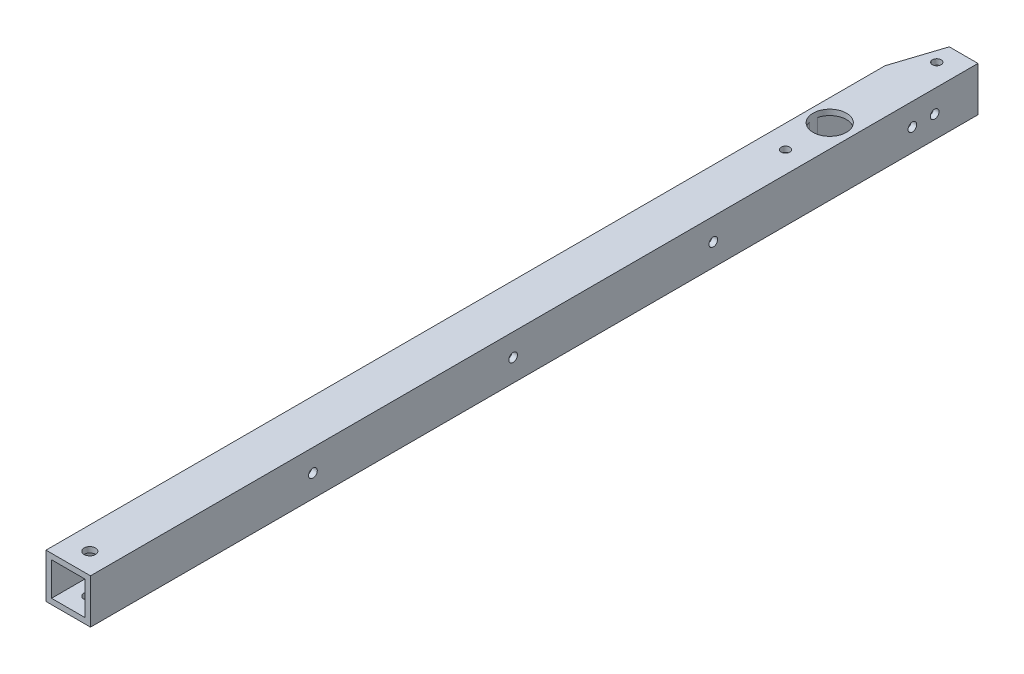
ISO-10303-21;
HEADER;
FILE_DESCRIPTION(('STEP AP214'),'2;1');
FILE_NAME('part.step','',(''),(''),'','','');
FILE_SCHEMA(('AUTOMOTIVE_DESIGN { 1 0 10303 214 1 1 1 1 }'));
ENDSEC;
DATA;
#1=APPLICATION_CONTEXT('core data for automotive mechanical design processes');
#2=APPLICATION_PROTOCOL_DEFINITION('international standard','automotive_design',2000,#1);
#3=PRODUCT_CONTEXT('',#1,'mechanical');
#4=PRODUCT('Part','Part','',(#3));
#5=PRODUCT_RELATED_PRODUCT_CATEGORY('part','',(#4));
#6=PRODUCT_DEFINITION_FORMATION('','',#4);
#7=PRODUCT_DEFINITION_CONTEXT('part definition',#1,'design');
#8=PRODUCT_DEFINITION('design','',#6,#7);
#9=PRODUCT_DEFINITION_SHAPE('','',#8);
#10=(LENGTH_UNIT() NAMED_UNIT(*) SI_UNIT(.MILLI.,.METRE.));
#11=(NAMED_UNIT(*) PLANE_ANGLE_UNIT() SI_UNIT($,.RADIAN.));
#12=(NAMED_UNIT(*) SI_UNIT($,.STERADIAN.) SOLID_ANGLE_UNIT());
#13=UNCERTAINTY_MEASURE_WITH_UNIT(LENGTH_MEASURE(1.E-05),#10,'distance_accuracy_value','');
#14=(GEOMETRIC_REPRESENTATION_CONTEXT(3) GLOBAL_UNCERTAINTY_ASSIGNED_CONTEXT((#13)) GLOBAL_UNIT_ASSIGNED_CONTEXT((#10,
#11,#12)) REPRESENTATION_CONTEXT('',''));
#15=CARTESIAN_POINT('',(0.,0.,0.));
#16=DIRECTION('',(0.,0.,1.));
#17=DIRECTION('',(1.,0.,0.));
#18=AXIS2_PLACEMENT_3D('',#15,#16,#17);
#19=CARTESIAN_POINT('',(-9.52500000000001,9.525,260.35));
#20=DIRECTION('',(1.,0.,0.));
#21=DIRECTION('',(0.,1.,0.));
#22=AXIS2_PLACEMENT_3D('',#19,#20,#21);
#23=PLANE('',#22);
#24=CARTESIAN_POINT('',(-9.525,0.,133.35));
#25=DIRECTION('',(1.,0.,0.));
#26=DIRECTION('',(0.,1.,0.));
#27=AXIS2_PLACEMENT_3D('',#24,#25,#26);
#28=CIRCLE('',#27,2.48919999999999);
#29=CARTESIAN_POINT('',(-9.525,2.48919999999999,133.35));
#30=VERTEX_POINT('',#29);
#31=EDGE_CURVE('E226',#30,#30,#28,.T.);
#32=ORIENTED_EDGE('',*,*,#31,.F.);
#33=EDGE_LOOP('',(#32));
#34=FACE_BOUND('',#33,.T.);
#35=CARTESIAN_POINT('',(-9.525,0.,19.05));
#36=DIRECTION('',(1.,0.,0.));
#37=DIRECTION('',(0.,1.,0.));
#38=AXIS2_PLACEMENT_3D('',#35,#36,#37);
#39=CIRCLE('',#38,2.48919999999999);
#40=CARTESIAN_POINT('',(-9.525,2.48919999999999,19.05));
#41=VERTEX_POINT('',#40);
#42=EDGE_CURVE('E213',#41,#41,#39,.T.);
#43=ORIENTED_EDGE('',*,*,#42,.F.);
#44=EDGE_LOOP('',(#43));
#45=FACE_BOUND('',#44,.T.);
#46=CARTESIAN_POINT('',(-9.525,0.,-95.25));
#47=DIRECTION('',(1.,0.,0.));
#48=DIRECTION('',(0.,1.,0.));
#49=AXIS2_PLACEMENT_3D('',#46,#47,#48);
#50=CIRCLE('',#49,2.48919999999999);
#51=CARTESIAN_POINT('',(-9.525,2.48919999999999,-95.25));
#52=VERTEX_POINT('',#51);
#53=EDGE_CURVE('E209',#52,#52,#50,.T.);
#54=ORIENTED_EDGE('',*,*,#53,.F.);
#55=EDGE_LOOP('',(#54));
#56=FACE_BOUND('',#55,.T.);
#57=DIRECTION('',(0.,-1.,0.));
#58=VECTOR('',#57,1.);
#59=CARTESIAN_POINT('',(-9.52500000000001,12.7,-172.419004247251));
#60=LINE('',#59,#58);
#61=CARTESIAN_POINT('',(-9.52500000000001,9.525,-172.419004247251));
#62=VERTEX_POINT('',#61);
#63=CARTESIAN_POINT('',(-9.525,-9.525,-172.419004247251));
#64=VERTEX_POINT('',#63);
#65=EDGE_CURVE('E128',#62,#64,#60,.T.);
#66=ORIENTED_EDGE('',*,*,#65,.F.);
#67=DIRECTION('',(0.,0.,-1.));
#68=VECTOR('',#67,1.);
#69=CARTESIAN_POINT('',(-9.52500000000001,9.525,260.35));
#70=LINE('',#69,#68);
#71=CARTESIAN_POINT('',(-9.52500000000001,9.525,260.35));
#72=VERTEX_POINT('',#71);
#73=EDGE_CURVE('E136',#72,#62,#70,.T.);
#74=ORIENTED_EDGE('',*,*,#73,.F.);
#75=DIRECTION('',(0.,-1.,0.));
#76=VECTOR('',#75,1.);
#77=CARTESIAN_POINT('',(-9.52500000000001,9.525,260.35));
#78=LINE('',#77,#76);
#79=CARTESIAN_POINT('',(-9.525,-9.525,260.35));
#80=VERTEX_POINT('',#79);
#81=EDGE_CURVE('E295',#72,#80,#78,.T.);
#82=ORIENTED_EDGE('',*,*,#81,.T.);
#83=DIRECTION('',(0.,0.,-1.));
#84=VECTOR('',#83,1.);
#85=CARTESIAN_POINT('',(-9.525,-9.525,260.35));
#86=LINE('',#85,#84);
#87=EDGE_CURVE('E139',#80,#64,#86,.T.);
#88=ORIENTED_EDGE('',*,*,#87,.T.);
#89=EDGE_LOOP('',(#66,#74,#82,#88));
#90=FACE_BOUND('',#89,.T.);
#91=ADVANCED_FACE('F37',(#34,#45,#56,#90),#23,.T.);
#92=CARTESIAN_POINT('',(0.,0.,260.35));
#93=DIRECTION('',(0.,0.,1.));
#94=DIRECTION('',(1.,0.,0.));
#95=AXIS2_PLACEMENT_3D('',#92,#93,#94);
#96=PLANE('',#95);
#97=DIRECTION('',(0.,-1.,0.));
#98=VECTOR('',#97,1.);
#99=CARTESIAN_POINT('',(-12.7,12.7,260.35));
#100=LINE('',#99,#98);
#101=CARTESIAN_POINT('',(-12.7,12.7,260.35));
#102=VERTEX_POINT('',#101);
#103=CARTESIAN_POINT('',(-12.7,-12.7,260.35));
#104=VERTEX_POINT('',#103);
#105=EDGE_CURVE('E158',#102,#104,#100,.T.);
#106=ORIENTED_EDGE('',*,*,#105,.T.);
#107=DIRECTION('',(1.,0.,0.));
#108=VECTOR('',#107,1.);
#109=CARTESIAN_POINT('',(-12.7,-12.7,260.35));
#110=LINE('',#109,#108);
#111=CARTESIAN_POINT('',(12.7,-12.7,260.35));
#112=VERTEX_POINT('',#111);
#113=EDGE_CURVE('E161',#104,#112,#110,.T.);
#114=ORIENTED_EDGE('',*,*,#113,.T.);
#115=DIRECTION('',(0.,1.,0.));
#116=VECTOR('',#115,1.);
#117=CARTESIAN_POINT('',(12.7,-12.7,260.35));
#118=LINE('',#117,#116);
#119=CARTESIAN_POINT('',(12.7,12.7,260.35));
#120=VERTEX_POINT('',#119);
#121=EDGE_CURVE('E163',#112,#120,#118,.T.);
#122=ORIENTED_EDGE('',*,*,#121,.T.);
#123=DIRECTION('',(-1.,0.,0.));
#124=VECTOR('',#123,1.);
#125=CARTESIAN_POINT('',(12.7,12.7,260.35));
#126=LINE('',#125,#124);
#127=EDGE_CURVE('E165',#120,#102,#126,.T.);
#128=ORIENTED_EDGE('',*,*,#127,.T.);
#129=EDGE_LOOP('',(#106,#114,#122,#128));
#130=FACE_BOUND('',#129,.T.);
#131=DIRECTION('',(1.,0.,0.));
#132=VECTOR('',#131,1.);
#133=CARTESIAN_POINT('',(-9.525,-9.525,260.35));
#134=LINE('',#133,#132);
#135=CARTESIAN_POINT('',(9.52500000000001,-9.525,260.35));
#136=VERTEX_POINT('',#135);
#137=EDGE_CURVE('E297',#80,#136,#134,.T.);
#138=ORIENTED_EDGE('',*,*,#137,.F.);
#139=ORIENTED_EDGE('',*,*,#81,.F.);
#140=DIRECTION('',(-1.,0.,0.));
#141=VECTOR('',#140,1.);
#142=CARTESIAN_POINT('',(9.525,9.525,260.35));
#143=LINE('',#142,#141);
#144=CARTESIAN_POINT('',(9.525,9.525,260.35));
#145=VERTEX_POINT('',#144);
#146=EDGE_CURVE('E144',#145,#72,#143,.T.);
#147=ORIENTED_EDGE('',*,*,#146,.F.);
#148=DIRECTION('',(0.,1.,0.));
#149=VECTOR('',#148,1.);
#150=CARTESIAN_POINT('',(9.52500000000001,-9.525,260.35));
#151=LINE('',#150,#149);
#152=EDGE_CURVE('E298',#136,#145,#151,.T.);
#153=ORIENTED_EDGE('',*,*,#152,.F.);
#154=EDGE_LOOP('',(#138,#139,#147,#153));
#155=FACE_BOUND('',#154,.T.);
#156=ADVANCED_FACE('F307',(#130,#155),#96,.T.);
#157=CARTESIAN_POINT('',(-12.7,12.7,260.35));
#158=DIRECTION('',(1.,0.,0.));
#159=DIRECTION('',(0.,0.,-1.));
#160=AXIS2_PLACEMENT_3D('',#157,#158,#159);
#161=PLANE('',#160);
#162=CARTESIAN_POINT('',(-12.7,0.,133.35));
#163=DIRECTION('',(1.,0.,0.));
#164=DIRECTION('',(0.,0.,-1.));
#165=AXIS2_PLACEMENT_3D('',#162,#163,#164);
#166=CIRCLE('',#165,2.4892);
#167=CARTESIAN_POINT('',(-12.7,0.,130.8608));
#168=VERTEX_POINT('',#167);
#169=EDGE_CURVE('E449',#168,#168,#166,.T.);
#170=ORIENTED_EDGE('',*,*,#169,.T.);
#171=EDGE_LOOP('',(#170));
#172=FACE_BOUND('',#171,.T.);
#173=CARTESIAN_POINT('',(-12.7,0.,19.05));
#174=DIRECTION('',(1.,0.,0.));
#175=DIRECTION('',(0.,0.,-1.));
#176=AXIS2_PLACEMENT_3D('',#173,#174,#175);
#177=CIRCLE('',#176,2.4892);
#178=CARTESIAN_POINT('',(-12.7,0.,16.5608));
#179=VERTEX_POINT('',#178);
#180=EDGE_CURVE('E214',#179,#179,#177,.T.);
#181=ORIENTED_EDGE('',*,*,#180,.T.);
#182=EDGE_LOOP('',(#181));
#183=FACE_BOUND('',#182,.T.);
#184=CARTESIAN_POINT('',(-12.7,0.,-95.25));
#185=DIRECTION('',(1.,0.,0.));
#186=DIRECTION('',(0.,0.,-1.));
#187=AXIS2_PLACEMENT_3D('',#184,#185,#186);
#188=CIRCLE('',#187,2.4892);
#189=CARTESIAN_POINT('',(-12.7,0.,-97.7392));
#190=VERTEX_POINT('',#189);
#191=EDGE_CURVE('E210',#190,#190,#188,.T.);
#192=ORIENTED_EDGE('',*,*,#191,.T.);
#193=EDGE_LOOP('',(#192));
#194=FACE_BOUND('',#193,.T.);
#195=DIRECTION('',(0.,0.,-1.));
#196=VECTOR('',#195,1.);
#197=CARTESIAN_POINT('',(-12.7,12.7,260.35));
#198=LINE('',#197,#196);
#199=CARTESIAN_POINT('',(-12.7,12.7,-218.66352));
#200=VERTEX_POINT('',#199);
#201=EDGE_CURVE('E167',#102,#200,#198,.T.);
#202=ORIENTED_EDGE('',*,*,#201,.T.);
#203=DIRECTION('',(0.,1.,0.));
#204=VECTOR('',#203,1.);
#205=CARTESIAN_POINT('',(-12.7,-12.7,-218.66352));
#206=LINE('',#205,#204);
#207=CARTESIAN_POINT('',(-12.7,-12.7,-218.66352));
#208=VERTEX_POINT('',#207);
#209=EDGE_CURVE('E278',#208,#200,#206,.T.);
#210=ORIENTED_EDGE('',*,*,#209,.F.);
#211=DIRECTION('',(0.,0.,-1.));
#212=VECTOR('',#211,1.);
#213=CARTESIAN_POINT('',(-12.7,-12.7,260.35));
#214=LINE('',#213,#212);
#215=EDGE_CURVE('E176',#104,#208,#214,.T.);
#216=ORIENTED_EDGE('',*,*,#215,.F.);
#217=ORIENTED_EDGE('',*,*,#105,.F.);
#218=EDGE_LOOP('',(#202,#210,#216,#217));
#219=FACE_BOUND('',#218,.T.);
#220=ADVANCED_FACE('F39',(#172,#183,#194,#219),#161,.F.);
#221=CARTESIAN_POINT('',(-12.7,-12.7,260.35));
#222=DIRECTION('',(0.,1.,0.));
#223=DIRECTION('',(-1.,0.,0.));
#224=AXIS2_PLACEMENT_3D('',#221,#222,#223);
#225=PLANE('',#224);
#226=CARTESIAN_POINT('',(0.364005636299401,-12.7,248.381514442299));
#227=DIRECTION('',(0.,1.,0.));
#228=DIRECTION('',(0.,0.,1.));
#229=AXIS2_PLACEMENT_3D('',#226,#227,#228);
#230=CIRCLE('',#229,3.26389999999999);
#231=CARTESIAN_POINT('',(0.364005636299401,-12.7,251.645414442299));
#232=VERTEX_POINT('',#231);
#233=EDGE_CURVE('E197',#232,#232,#230,.T.);
#234=ORIENTED_EDGE('',*,*,#233,.T.);
#235=EDGE_LOOP('',(#234));
#236=FACE_BOUND('',#235,.T.);
#237=CARTESIAN_POINT('',(0.379684713264274,-12.7,-148.78654965825));
#238=DIRECTION('',(0.,1.,0.));
#239=DIRECTION('',(0.,0.,1.));
#240=AXIS2_PLACEMENT_3D('',#237,#238,#239);
#241=CIRCLE('',#240,2.4892);
#242=CARTESIAN_POINT('',(0.379684713264274,-12.7,-146.29734965825));
#243=VERTEX_POINT('',#242);
#244=EDGE_CURVE('E192',#243,#243,#241,.T.);
#245=ORIENTED_EDGE('',*,*,#244,.T.);
#246=EDGE_LOOP('',(#245));
#247=FACE_BOUND('',#246,.T.);
#248=CARTESIAN_POINT('',(0.383095120328707,-12.7,-235.173069730931));
#249=DIRECTION('',(0.,1.,0.));
#250=DIRECTION('',(0.,0.,1.));
#251=AXIS2_PLACEMENT_3D('',#248,#249,#250);
#252=CIRCLE('',#251,2.4892);
#253=CARTESIAN_POINT('',(0.383095120328707,-12.7,-232.683869730931));
#254=VERTEX_POINT('',#253);
#255=EDGE_CURVE('E187',#254,#254,#252,.T.);
#256=ORIENTED_EDGE('',*,*,#255,.T.);
#257=EDGE_LOOP('',(#256));
#258=FACE_BOUND('',#257,.T.);
#259=CARTESIAN_POINT('',(-0.277971341159197,-12.7,-174.703317268581));
#260=DIRECTION('',(0.,-1.,0.));
#261=DIRECTION('',(1.,0.,0.));
#262=AXIS2_PLACEMENT_3D('',#259,#260,#261);
#263=CIRCLE('',#262,9.52499999983412);
#264=CARTESIAN_POINT('',(9.24702865867493,-12.7,-174.703317268581));
#265=VERTEX_POINT('',#264);
#266=EDGE_CURVE('E260',#265,#265,#263,.T.);
#267=ORIENTED_EDGE('',*,*,#266,.F.);
#268=EDGE_LOOP('',(#267));
#269=FACE_BOUND('',#268,.T.);
#270=ORIENTED_EDGE('',*,*,#215,.T.);
#271=DIRECTION('',(0.309054540384021,0.,-0.951044316037913));
#272=VECTOR('',#271,1.);
#273=CARTESIAN_POINT('',(-3.69316,-12.7,-246.38));
#274=LINE('',#273,#272);
#275=CARTESIAN_POINT('',(-3.69316,-12.7,-246.38));
#276=VERTEX_POINT('',#275);
#277=EDGE_CURVE('E268',#208,#276,#274,.T.);
#278=ORIENTED_EDGE('',*,*,#277,.T.);
#279=DIRECTION('',(1.,0.,0.));
#280=VECTOR('',#279,1.);
#281=CARTESIAN_POINT('',(12.7,-12.7,-246.38));
#282=LINE('',#281,#280);
#283=CARTESIAN_POINT('',(12.7,-12.7,-246.38));
#284=VERTEX_POINT('',#283);
#285=EDGE_CURVE('E271',#276,#284,#282,.T.);
#286=ORIENTED_EDGE('',*,*,#285,.T.);
#287=DIRECTION('',(0.,0.,-1.));
#288=VECTOR('',#287,1.);
#289=CARTESIAN_POINT('',(12.7,-12.7,260.35));
#290=LINE('',#289,#288);
#291=EDGE_CURVE('E173',#112,#284,#290,.T.);
#292=ORIENTED_EDGE('',*,*,#291,.F.);
#293=ORIENTED_EDGE('',*,*,#113,.F.);
#294=EDGE_LOOP('',(#270,#278,#286,#292,#293));
#295=FACE_BOUND('',#294,.T.);
#296=ADVANCED_FACE('F332',(#236,#247,#258,#269,#295),#225,.F.);
#297=CARTESIAN_POINT('',(12.7,-12.7,260.35));
#298=DIRECTION('',(-1.,0.,0.));
#299=DIRECTION('',(0.,0.,1.));
#300=AXIS2_PLACEMENT_3D('',#297,#298,#299);
#301=PLANE('',#300);
#302=CARTESIAN_POINT('',(12.7,0.,133.35));
#303=DIRECTION('',(1.,0.,0.));
#304=DIRECTION('',(0.,0.,-1.));
#305=AXIS2_PLACEMENT_3D('',#302,#303,#304);
#306=CIRCLE('',#305,2.48919999999999);
#307=CARTESIAN_POINT('',(12.7,0.,130.8608));
#308=VERTEX_POINT('',#307);
#309=EDGE_CURVE('E448',#308,#308,#306,.T.);
#310=ORIENTED_EDGE('',*,*,#309,.F.);
#311=EDGE_LOOP('',(#310));
#312=FACE_BOUND('',#311,.T.);
#313=CARTESIAN_POINT('',(12.7,0.,19.05));
#314=DIRECTION('',(1.,0.,0.));
#315=DIRECTION('',(0.,0.,-1.));
#316=AXIS2_PLACEMENT_3D('',#313,#314,#315);
#317=CIRCLE('',#316,2.48919999999999);
#318=CARTESIAN_POINT('',(12.7,0.,16.5608));
#319=VERTEX_POINT('',#318);
#320=EDGE_CURVE('E221',#319,#319,#317,.T.);
#321=ORIENTED_EDGE('',*,*,#320,.F.);
#322=EDGE_LOOP('',(#321));
#323=FACE_BOUND('',#322,.T.);
#324=CARTESIAN_POINT('',(12.7,0.,-95.25));
#325=DIRECTION('',(1.,0.,0.));
#326=DIRECTION('',(0.,0.,-1.));
#327=AXIS2_PLACEMENT_3D('',#324,#325,#326);
#328=CIRCLE('',#327,2.48919999999999);
#329=CARTESIAN_POINT('',(12.7,0.,-97.7392));
#330=VERTEX_POINT('',#329);
#331=EDGE_CURVE('E218',#330,#330,#328,.T.);
#332=ORIENTED_EDGE('',*,*,#331,.F.);
#333=EDGE_LOOP('',(#332));
#334=FACE_BOUND('',#333,.T.);
#335=CARTESIAN_POINT('',(12.7,0.,-221.615));
#336=DIRECTION('',(1.,0.,0.));
#337=DIRECTION('',(0.,0.,-1.));
#338=AXIS2_PLACEMENT_3D('',#335,#336,#337);
#339=CIRCLE('',#338,2.48919999999999);
#340=CARTESIAN_POINT('',(12.7,0.,-224.1042));
#341=VERTEX_POINT('',#340);
#342=EDGE_CURVE('E206',#341,#341,#339,.T.);
#343=ORIENTED_EDGE('',*,*,#342,.F.);
#344=EDGE_LOOP('',(#343));
#345=FACE_BOUND('',#344,.T.);
#346=CARTESIAN_POINT('',(12.7,0.,-208.915));
#347=DIRECTION('',(1.,0.,0.));
#348=DIRECTION('',(0.,0.,-1.));
#349=AXIS2_PLACEMENT_3D('',#346,#347,#348);
#350=CIRCLE('',#349,2.48919999999999);
#351=CARTESIAN_POINT('',(12.7,0.,-211.4042));
#352=VERTEX_POINT('',#351);
#353=EDGE_CURVE('E202',#352,#352,#350,.T.);
#354=ORIENTED_EDGE('',*,*,#353,.F.);
#355=EDGE_LOOP('',(#354));
#356=FACE_BOUND('',#355,.T.);
#357=ORIENTED_EDGE('',*,*,#291,.T.);
#358=DIRECTION('',(0.,1.,0.));
#359=VECTOR('',#358,1.);
#360=CARTESIAN_POINT('',(12.7,-12.7,-246.38));
#361=LINE('',#360,#359);
#362=CARTESIAN_POINT('',(12.7,12.7,-246.38));
#363=VERTEX_POINT('',#362);
#364=EDGE_CURVE('E281',#284,#363,#361,.T.);
#365=ORIENTED_EDGE('',*,*,#364,.T.);
#366=DIRECTION('',(0.,0.,-1.));
#367=VECTOR('',#366,1.);
#368=CARTESIAN_POINT('',(12.7,12.7,260.35));
#369=LINE('',#368,#367);
#370=EDGE_CURVE('E170',#120,#363,#369,.T.);
#371=ORIENTED_EDGE('',*,*,#370,.F.);
#372=ORIENTED_EDGE('',*,*,#121,.F.);
#373=EDGE_LOOP('',(#357,#365,#371,#372));
#374=FACE_BOUND('',#373,.T.);
#375=ADVANCED_FACE('F328',(#312,#323,#334,#345,#356,#374),#301,.F.);
#376=CARTESIAN_POINT('',(12.7,12.7,260.35));
#377=DIRECTION('',(0.,-1.,0.));
#378=DIRECTION('',(1.,0.,0.));
#379=AXIS2_PLACEMENT_3D('',#376,#377,#378);
#380=PLANE('',#379);
#381=CARTESIAN_POINT('',(0.364005636299401,12.7,248.381514442299));
#382=DIRECTION('',(0.,1.,0.));
#383=DIRECTION('',(0.,0.,1.));
#384=AXIS2_PLACEMENT_3D('',#381,#382,#383);
#385=CIRCLE('',#384,3.26389999999999);
#386=CARTESIAN_POINT('',(0.364005636299401,12.7,251.645414442299));
#387=VERTEX_POINT('',#386);
#388=EDGE_CURVE('E201',#387,#387,#385,.T.);
#389=ORIENTED_EDGE('',*,*,#388,.F.);
#390=EDGE_LOOP('',(#389));
#391=FACE_BOUND('',#390,.T.);
#392=CARTESIAN_POINT('',(0.379684713264274,12.7,-148.78654965825));
#393=DIRECTION('',(0.,1.,0.));
#394=DIRECTION('',(0.,0.,1.));
#395=AXIS2_PLACEMENT_3D('',#392,#393,#394);
#396=CIRCLE('',#395,2.48919999999999);
#397=CARTESIAN_POINT('',(0.379684713264274,12.7,-146.29734965825));
#398=VERTEX_POINT('',#397);
#399=EDGE_CURVE('E246',#398,#398,#396,.T.);
#400=ORIENTED_EDGE('',*,*,#399,.F.);
#401=EDGE_LOOP('',(#400));
#402=FACE_BOUND('',#401,.T.);
#403=CARTESIAN_POINT('',(0.383095120328707,12.7,-235.173069730931));
#404=DIRECTION('',(0.,1.,0.));
#405=DIRECTION('',(0.,0.,1.));
#406=AXIS2_PLACEMENT_3D('',#403,#404,#405);
#407=CIRCLE('',#406,2.48919999999999);
#408=CARTESIAN_POINT('',(0.383095120328707,12.7,-232.683869730931));
#409=VERTEX_POINT('',#408);
#410=EDGE_CURVE('E253',#409,#409,#407,.T.);
#411=ORIENTED_EDGE('',*,*,#410,.F.);
#412=EDGE_LOOP('',(#411));
#413=FACE_BOUND('',#412,.T.);
#414=CARTESIAN_POINT('',(-0.2779713411592,12.7,-174.703317268581));
#415=DIRECTION('',(0.,-1.,0.));
#416=DIRECTION('',(1.,0.,0.));
#417=AXIS2_PLACEMENT_3D('',#414,#415,#416);
#418=CIRCLE('',#417,9.52499999983412);
#419=CARTESIAN_POINT('',(9.24702865867492,12.7,-174.703317268581));
#420=VERTEX_POINT('',#419);
#421=EDGE_CURVE('E261',#420,#420,#418,.T.);
#422=ORIENTED_EDGE('',*,*,#421,.T.);
#423=EDGE_LOOP('',(#422));
#424=FACE_BOUND('',#423,.T.);
#425=DIRECTION('',(1.,0.,0.));
#426=VECTOR('',#425,1.);
#427=CARTESIAN_POINT('',(12.7,12.7,-246.38));
#428=LINE('',#427,#426);
#429=CARTESIAN_POINT('',(-3.69316,12.7,-246.38));
#430=VERTEX_POINT('',#429);
#431=EDGE_CURVE('E272',#430,#363,#428,.T.);
#432=ORIENTED_EDGE('',*,*,#431,.F.);
#433=DIRECTION('',(0.309054540384021,0.,-0.951044316037913));
#434=VECTOR('',#433,1.);
#435=CARTESIAN_POINT('',(-3.69316,12.7,-246.38));
#436=LINE('',#435,#434);
#437=EDGE_CURVE('E61',#200,#430,#436,.T.);
#438=ORIENTED_EDGE('',*,*,#437,.F.);
#439=ORIENTED_EDGE('',*,*,#201,.F.);
#440=ORIENTED_EDGE('',*,*,#127,.F.);
#441=ORIENTED_EDGE('',*,*,#370,.T.);
#442=EDGE_LOOP('',(#432,#438,#439,#440,#441));
#443=FACE_BOUND('',#442,.T.);
#444=ADVANCED_FACE('F322',(#391,#402,#413,#424,#443),#380,.F.);
#445=DIRECTION('',(0.,-1.,0.));
#446=VECTOR('',#445,1.);
#447=CARTESIAN_POINT('',(-9.52500000000001,12.7,-176.987630289911));
#448=LINE('',#447,#446);
#449=CARTESIAN_POINT('',(-9.525,-9.525,-176.987630289911));
#450=VERTEX_POINT('',#449);
#451=CARTESIAN_POINT('',(-9.52500000000001,9.525,-176.987630289911));
#452=VERTEX_POINT('',#451);
#453=EDGE_CURVE('E53',#450,#452,#448,.F.);
#454=ORIENTED_EDGE('',*,*,#453,.F.);
#455=CARTESIAN_POINT('',(-9.525,-9.525,-228.433852769318));
#456=VERTEX_POINT('',#455);
#457=EDGE_CURVE('E156',#450,#456,#86,.T.);
#458=ORIENTED_EDGE('',*,*,#457,.T.);
#459=DIRECTION('',(0.,-1.,0.));
#460=VECTOR('',#459,1.);
#461=CARTESIAN_POINT('',(-9.52500000000001,9.52500000000048,-228.433852769317));
#462=LINE('',#461,#460);
#463=CARTESIAN_POINT('',(-9.52500000000001,9.525,-228.433852769317));
#464=VERTEX_POINT('',#463);
#465=EDGE_CURVE('E290',#464,#456,#462,.T.);
#466=ORIENTED_EDGE('',*,*,#465,.F.);
#467=EDGE_CURVE('E146',#452,#464,#70,.T.);
#468=ORIENTED_EDGE('',*,*,#467,.F.);
#469=EDGE_LOOP('',(#454,#458,#466,#468));
#470=FACE_BOUND('',#469,.T.);
#471=ADVANCED_FACE('F313',(#470),#23,.T.);
#472=CARTESIAN_POINT('',(-9.525,-9.525,260.35));
#473=DIRECTION('',(0.,1.,0.));
#474=DIRECTION('',(0.,0.,1.));
#475=AXIS2_PLACEMENT_3D('',#472,#473,#474);
#476=PLANE('',#475);
#477=CARTESIAN_POINT('',(0.364005636299401,-9.525,248.381514442299));
#478=DIRECTION('',(0.,1.,0.));
#479=DIRECTION('',(0.,0.,1.));
#480=AXIS2_PLACEMENT_3D('',#477,#478,#479);
#481=CIRCLE('',#480,3.26389999999999);
#482=CARTESIAN_POINT('',(0.364005636299401,-9.525,251.645414442299));
#483=VERTEX_POINT('',#482);
#484=EDGE_CURVE('E193',#483,#483,#481,.T.);
#485=ORIENTED_EDGE('',*,*,#484,.F.);
#486=EDGE_LOOP('',(#485));
#487=FACE_BOUND('',#486,.T.);
#488=CARTESIAN_POINT('',(0.379684713264274,-9.525,-148.78654965825));
#489=DIRECTION('',(0.,1.,0.));
#490=DIRECTION('',(0.,0.,1.));
#491=AXIS2_PLACEMENT_3D('',#488,#489,#490);
#492=CIRCLE('',#491,2.48919999999999);
#493=CARTESIAN_POINT('',(0.379684713264274,-9.525,-146.29734965825));
#494=VERTEX_POINT('',#493);
#495=EDGE_CURVE('E191',#494,#494,#492,.T.);
#496=ORIENTED_EDGE('',*,*,#495,.F.);
#497=EDGE_LOOP('',(#496));
#498=FACE_BOUND('',#497,.T.);
#499=CARTESIAN_POINT('',(0.383095120328707,-9.525,-235.173069730931));
#500=DIRECTION('',(0.,1.,0.));
#501=DIRECTION('',(0.,0.,1.));
#502=AXIS2_PLACEMENT_3D('',#499,#500,#501);
#503=CIRCLE('',#502,2.48919999999999);
#504=CARTESIAN_POINT('',(0.383095120328707,-9.525,-232.683869730931));
#505=VERTEX_POINT('',#504);
#506=EDGE_CURVE('E186',#505,#505,#503,.T.);
#507=ORIENTED_EDGE('',*,*,#506,.F.);
#508=EDGE_LOOP('',(#507));
#509=FACE_BOUND('',#508,.T.);
#510=CARTESIAN_POINT('',(-0.277971341159197,-9.525,-174.703317268581));
#511=DIRECTION('',(0.,1.,0.));
#512=DIRECTION('',(0.,0.,1.));
#513=AXIS2_PLACEMENT_3D('',#510,#511,#512);
#514=CIRCLE('',#513,9.52499999983412);
#515=EDGE_CURVE('E140',#64,#450,#514,.T.);
#516=ORIENTED_EDGE('',*,*,#515,.F.);
#517=ORIENTED_EDGE('',*,*,#87,.F.);
#518=ORIENTED_EDGE('',*,*,#137,.T.);
#519=DIRECTION('',(0.,0.,-1.));
#520=VECTOR('',#519,1.);
#521=CARTESIAN_POINT('',(9.52500000000001,-9.525,260.35));
#522=LINE('',#521,#520);
#523=CARTESIAN_POINT('',(9.52500000000001,-9.525,-246.38));
#524=VERTEX_POINT('',#523);
#525=EDGE_CURVE('E149',#136,#524,#522,.T.);
#526=ORIENTED_EDGE('',*,*,#525,.T.);
#527=DIRECTION('',(1.,0.,0.));
#528=VECTOR('',#527,1.);
#529=CARTESIAN_POINT('',(-9.525,-9.525,-246.38));
#530=LINE('',#529,#528);
#531=CARTESIAN_POINT('',(-3.69316,-9.525,-246.38));
#532=VERTEX_POINT('',#531);
#533=EDGE_CURVE('E288',#532,#524,#530,.T.);
#534=ORIENTED_EDGE('',*,*,#533,.F.);
#535=DIRECTION('',(0.309054540384021,0.,-0.951044316037913));
#536=VECTOR('',#535,1.);
#537=CARTESIAN_POINT('',(-153.190580804676,-9.525,213.663952572087));
#538=LINE('',#537,#536);
#539=EDGE_CURVE('E293',#456,#532,#538,.T.);
#540=ORIENTED_EDGE('',*,*,#539,.F.);
#541=ORIENTED_EDGE('',*,*,#457,.F.);
#542=EDGE_LOOP('',(#516,#517,#518,#526,#534,#540,#541));
#543=FACE_BOUND('',#542,.T.);
#544=ADVANCED_FACE('F309',(#487,#498,#509,#543),#476,.T.);
#545=CARTESIAN_POINT('',(9.52500000000001,-9.525,260.35));
#546=DIRECTION('',(-1.,0.,0.));
#547=DIRECTION('',(0.,-1.,0.));
#548=AXIS2_PLACEMENT_3D('',#545,#546,#547);
#549=PLANE('',#548);
#550=CARTESIAN_POINT('',(9.525,0.,133.35));
#551=DIRECTION('',(-1.,0.,0.));
#552=DIRECTION('',(0.,-1.,0.));
#553=AXIS2_PLACEMENT_3D('',#550,#551,#552);
#554=CIRCLE('',#553,2.48919999999999);
#555=CARTESIAN_POINT('',(9.525,-2.48919999999999,133.35));
#556=VERTEX_POINT('',#555);
#557=EDGE_CURVE('E41',#556,#556,#554,.T.);
#558=ORIENTED_EDGE('',*,*,#557,.F.);
#559=EDGE_LOOP('',(#558));
#560=FACE_BOUND('',#559,.T.);
#561=CARTESIAN_POINT('',(9.525,0.,19.05));
#562=DIRECTION('',(-1.,0.,0.));
#563=DIRECTION('',(0.,-1.,0.));
#564=AXIS2_PLACEMENT_3D('',#561,#562,#563);
#565=CIRCLE('',#564,2.48919999999999);
#566=CARTESIAN_POINT('',(9.525,-2.48919999999999,19.05));
#567=VERTEX_POINT('',#566);
#568=EDGE_CURVE('E211',#567,#567,#565,.T.);
#569=ORIENTED_EDGE('',*,*,#568,.F.);
#570=EDGE_LOOP('',(#569));
#571=FACE_BOUND('',#570,.T.);
#572=CARTESIAN_POINT('',(9.525,0.,-95.25));
#573=DIRECTION('',(-1.,0.,0.));
#574=DIRECTION('',(0.,-1.,0.));
#575=AXIS2_PLACEMENT_3D('',#572,#573,#574);
#576=CIRCLE('',#575,2.48919999999999);
#577=CARTESIAN_POINT('',(9.525,-2.48919999999999,-95.25));
#578=VERTEX_POINT('',#577);
#579=EDGE_CURVE('E207',#578,#578,#576,.T.);
#580=ORIENTED_EDGE('',*,*,#579,.F.);
#581=EDGE_LOOP('',(#580));
#582=FACE_BOUND('',#581,.T.);
#583=CARTESIAN_POINT('',(9.525,0.,-221.615));
#584=DIRECTION('',(-1.,0.,0.));
#585=DIRECTION('',(0.,-1.,0.));
#586=AXIS2_PLACEMENT_3D('',#583,#584,#585);
#587=CIRCLE('',#586,2.48919999999999);
#588=CARTESIAN_POINT('',(9.525,-2.48919999999999,-221.615));
#589=VERTEX_POINT('',#588);
#590=EDGE_CURVE('E203',#589,#589,#587,.T.);
#591=ORIENTED_EDGE('',*,*,#590,.F.);
#592=EDGE_LOOP('',(#591));
#593=FACE_BOUND('',#592,.T.);
#594=CARTESIAN_POINT('',(9.525,0.,-208.915));
#595=DIRECTION('',(-1.,0.,0.));
#596=DIRECTION('',(0.,-1.,0.));
#597=AXIS2_PLACEMENT_3D('',#594,#595,#596);
#598=CIRCLE('',#597,2.48919999999999);
#599=CARTESIAN_POINT('',(9.525,-2.48919999999999,-208.915));
#600=VERTEX_POINT('',#599);
#601=EDGE_CURVE('E198',#600,#600,#598,.T.);
#602=ORIENTED_EDGE('',*,*,#601,.F.);
#603=EDGE_LOOP('',(#602));
#604=FACE_BOUND('',#603,.T.);
#605=DIRECTION('',(0.,1.,0.));
#606=VECTOR('',#605,1.);
#607=CARTESIAN_POINT('',(9.52500000000001,-9.525,-246.38));
#608=LINE('',#607,#606);
#609=CARTESIAN_POINT('',(9.525,9.525,-246.38));
#610=VERTEX_POINT('',#609);
#611=EDGE_CURVE('E280',#524,#610,#608,.T.);
#612=ORIENTED_EDGE('',*,*,#611,.F.);
#613=ORIENTED_EDGE('',*,*,#525,.F.);
#614=ORIENTED_EDGE('',*,*,#152,.T.);
#615=DIRECTION('',(0.,0.,-1.));
#616=VECTOR('',#615,1.);
#617=CARTESIAN_POINT('',(9.525,9.525,260.35));
#618=LINE('',#617,#616);
#619=EDGE_CURVE('E145',#145,#610,#618,.T.);
#620=ORIENTED_EDGE('',*,*,#619,.T.);
#621=EDGE_LOOP('',(#612,#613,#614,#620));
#622=FACE_BOUND('',#621,.T.);
#623=ADVANCED_FACE('F304',(#560,#571,#582,#593,#604,#622),#549,.T.);
#624=CARTESIAN_POINT('',(9.525,9.525,260.35));
#625=DIRECTION('',(0.,-1.,0.));
#626=DIRECTION('',(0.,0.,-1.));
#627=AXIS2_PLACEMENT_3D('',#624,#625,#626);
#628=PLANE('',#627);
#629=CARTESIAN_POINT('',(0.364005636299401,9.525,248.381514442299));
#630=DIRECTION('',(0.,-1.,0.));
#631=DIRECTION('',(0.,0.,-1.));
#632=AXIS2_PLACEMENT_3D('',#629,#630,#631);
#633=CIRCLE('',#632,3.26389999999999);
#634=CARTESIAN_POINT('',(0.364005636299401,9.525,245.117614442299));
#635=VERTEX_POINT('',#634);
#636=EDGE_CURVE('E196',#635,#635,#633,.T.);
#637=ORIENTED_EDGE('',*,*,#636,.F.);
#638=EDGE_LOOP('',(#637));
#639=FACE_BOUND('',#638,.T.);
#640=CARTESIAN_POINT('',(0.379684713264274,9.525,-148.78654965825));
#641=DIRECTION('',(0.,-1.,0.));
#642=DIRECTION('',(0.,0.,-1.));
#643=AXIS2_PLACEMENT_3D('',#640,#641,#642);
#644=CIRCLE('',#643,2.48919999999999);
#645=CARTESIAN_POINT('',(0.379684713264274,9.525,-151.27574965825));
#646=VERTEX_POINT('',#645);
#647=EDGE_CURVE('E188',#646,#646,#644,.T.);
#648=ORIENTED_EDGE('',*,*,#647,.F.);
#649=EDGE_LOOP('',(#648));
#650=FACE_BOUND('',#649,.T.);
#651=CARTESIAN_POINT('',(0.383095120328707,9.525,-235.173069730931));
#652=DIRECTION('',(0.,-1.,0.));
#653=DIRECTION('',(0.,0.,-1.));
#654=AXIS2_PLACEMENT_3D('',#651,#652,#653);
#655=CIRCLE('',#654,2.48919999999999);
#656=CARTESIAN_POINT('',(0.383095120328707,9.525,-237.662269730931));
#657=VERTEX_POINT('',#656);
#658=EDGE_CURVE('E183',#657,#657,#655,.T.);
#659=ORIENTED_EDGE('',*,*,#658,.F.);
#660=EDGE_LOOP('',(#659));
#661=FACE_BOUND('',#660,.T.);
#662=CARTESIAN_POINT('',(-0.2779713411592,9.525,-174.703317268581));
#663=DIRECTION('',(0.,-1.,0.));
#664=DIRECTION('',(0.,0.,-1.));
#665=AXIS2_PLACEMENT_3D('',#662,#663,#664);
#666=CIRCLE('',#665,9.52499999983412);
#667=EDGE_CURVE('E11',#452,#62,#666,.T.);
#668=ORIENTED_EDGE('',*,*,#667,.F.);
#669=ORIENTED_EDGE('',*,*,#467,.T.);
#670=DIRECTION('',(-0.309054540384021,0.,0.951044316037913));
#671=VECTOR('',#670,1.);
#672=CARTESIAN_POINT('',(-151.371025599522,9.525,208.064689628308));
#673=LINE('',#672,#671);
#674=CARTESIAN_POINT('',(-3.69316,9.525,-246.38));
#675=VERTEX_POINT('',#674);
#676=EDGE_CURVE('E46',#675,#464,#673,.T.);
#677=ORIENTED_EDGE('',*,*,#676,.F.);
#678=DIRECTION('',(-1.,0.,0.));
#679=VECTOR('',#678,1.);
#680=CARTESIAN_POINT('',(9.525,9.525,-246.38));
#681=LINE('',#680,#679);
#682=EDGE_CURVE('E179',#610,#675,#681,.T.);
#683=ORIENTED_EDGE('',*,*,#682,.F.);
#684=ORIENTED_EDGE('',*,*,#619,.F.);
#685=ORIENTED_EDGE('',*,*,#146,.T.);
#686=ORIENTED_EDGE('',*,*,#73,.T.);
#687=EDGE_LOOP('',(#668,#669,#677,#683,#684,#685,#686));
#688=FACE_BOUND('',#687,.T.);
#689=ADVANCED_FACE('F142',(#639,#650,#661,#688),#628,.T.);
#690=CARTESIAN_POINT('',(-3.69316,-12.7,-246.38));
#691=DIRECTION('',(0.951044316037913,0.,0.309054540384021));
#692=DIRECTION('',(0.309054540384021,0.,-0.951044316037913));
#693=AXIS2_PLACEMENT_3D('',#690,#691,#692);
#694=PLANE('',#693);
#695=ORIENTED_EDGE('',*,*,#539,.T.);
#696=DIRECTION('',(0.,1.,0.));
#697=VECTOR('',#696,1.);
#698=CARTESIAN_POINT('',(-3.69316,-12.7,-246.38));
#699=LINE('',#698,#697);
#700=EDGE_CURVE('E284',#276,#532,#699,.T.);
#701=ORIENTED_EDGE('',*,*,#700,.F.);
#702=ORIENTED_EDGE('',*,*,#277,.F.);
#703=ORIENTED_EDGE('',*,*,#209,.T.);
#704=ORIENTED_EDGE('',*,*,#437,.T.);
#705=EDGE_CURVE('E275',#675,#430,#699,.T.);
#706=ORIENTED_EDGE('',*,*,#705,.F.);
#707=ORIENTED_EDGE('',*,*,#676,.T.);
#708=ORIENTED_EDGE('',*,*,#465,.T.);
#709=EDGE_LOOP('',(#695,#701,#702,#703,#704,#706,#707,#708));
#710=FACE_BOUND('',#709,.T.);
#711=ADVANCED_FACE('F317',(#710),#694,.F.);
#712=CARTESIAN_POINT('',(12.7,-12.7,-246.38));
#713=DIRECTION('',(0.,0.,1.));
#714=DIRECTION('',(1.,0.,0.));
#715=AXIS2_PLACEMENT_3D('',#712,#713,#714);
#716=PLANE('',#715);
#717=ORIENTED_EDGE('',*,*,#533,.T.);
#718=ORIENTED_EDGE('',*,*,#611,.T.);
#719=ORIENTED_EDGE('',*,*,#682,.T.);
#720=ORIENTED_EDGE('',*,*,#705,.T.);
#721=ORIENTED_EDGE('',*,*,#431,.T.);
#722=ORIENTED_EDGE('',*,*,#364,.F.);
#723=ORIENTED_EDGE('',*,*,#285,.F.);
#724=ORIENTED_EDGE('',*,*,#700,.T.);
#725=EDGE_LOOP('',(#717,#718,#719,#720,#721,#722,#723,#724));
#726=FACE_BOUND('',#725,.T.);
#727=ADVANCED_FACE('F320',(#726),#716,.F.);
#728=CARTESIAN_POINT('',(-0.2779713411592,12.7,-174.703317268581));
#729=DIRECTION('',(0.,-1.,0.));
#730=DIRECTION('',(1.,0.,0.));
#731=AXIS2_PLACEMENT_3D('',#728,#729,#730);
#732=CYLINDRICAL_SURFACE('',#731,9.52499999983412);
#733=ORIENTED_EDGE('',*,*,#515,.T.);
#734=ORIENTED_EDGE('',*,*,#453,.T.);
#735=ORIENTED_EDGE('',*,*,#667,.T.);
#736=ORIENTED_EDGE('',*,*,#65,.T.);
#737=EDGE_LOOP('',(#733,#734,#735,#736));
#738=FACE_BOUND('',#737,.T.);
#739=ORIENTED_EDGE('',*,*,#421,.F.);
#740=EDGE_LOOP('',(#739));
#741=FACE_BOUND('',#740,.T.);
#742=ORIENTED_EDGE('',*,*,#266,.T.);
#743=EDGE_LOOP('',(#742));
#744=FACE_BOUND('',#743,.T.);
#745=ADVANCED_FACE('F126',(#738,#741,#744),#732,.F.);
#746=CARTESIAN_POINT('',(0.383095120328707,12.7,-235.173069730931));
#747=DIRECTION('',(0.,1.,0.));
#748=DIRECTION('',(0.,0.,1.));
#749=AXIS2_PLACEMENT_3D('',#746,#747,#748);
#750=CYLINDRICAL_SURFACE('',#749,2.48919999999999);
#751=ORIENTED_EDGE('',*,*,#658,.T.);
#752=EDGE_LOOP('',(#751));
#753=FACE_BOUND('',#752,.T.);
#754=ORIENTED_EDGE('',*,*,#410,.T.);
#755=EDGE_LOOP('',(#754));
#756=FACE_BOUND('',#755,.T.);
#757=ADVANCED_FACE('F367',(#753,#756),#750,.F.);
#758=ORIENTED_EDGE('',*,*,#506,.T.);
#759=EDGE_LOOP('',(#758));
#760=FACE_BOUND('',#759,.T.);
#761=ORIENTED_EDGE('',*,*,#255,.F.);
#762=EDGE_LOOP('',(#761));
#763=FACE_BOUND('',#762,.T.);
#764=ADVANCED_FACE('F373',(#760,#763),#750,.F.);
#765=CARTESIAN_POINT('',(0.379684713264274,12.7,-148.78654965825));
#766=DIRECTION('',(0.,1.,0.));
#767=DIRECTION('',(0.,0.,1.));
#768=AXIS2_PLACEMENT_3D('',#765,#766,#767);
#769=CYLINDRICAL_SURFACE('',#768,2.48919999999999);
#770=ORIENTED_EDGE('',*,*,#647,.T.);
#771=EDGE_LOOP('',(#770));
#772=FACE_BOUND('',#771,.T.);
#773=ORIENTED_EDGE('',*,*,#399,.T.);
#774=EDGE_LOOP('',(#773));
#775=FACE_BOUND('',#774,.T.);
#776=ADVANCED_FACE('F399',(#772,#775),#769,.F.);
#777=ORIENTED_EDGE('',*,*,#495,.T.);
#778=EDGE_LOOP('',(#777));
#779=FACE_BOUND('',#778,.T.);
#780=ORIENTED_EDGE('',*,*,#244,.F.);
#781=EDGE_LOOP('',(#780));
#782=FACE_BOUND('',#781,.T.);
#783=ADVANCED_FACE('F403',(#779,#782),#769,.F.);
#784=CARTESIAN_POINT('',(0.364005636299401,12.7,248.381514442299));
#785=DIRECTION('',(0.,1.,0.));
#786=DIRECTION('',(0.,0.,1.));
#787=AXIS2_PLACEMENT_3D('',#784,#785,#786);
#788=CYLINDRICAL_SURFACE('',#787,3.26389999999999);
#789=ORIENTED_EDGE('',*,*,#484,.T.);
#790=EDGE_LOOP('',(#789));
#791=FACE_BOUND('',#790,.T.);
#792=ORIENTED_EDGE('',*,*,#233,.F.);
#793=EDGE_LOOP('',(#792));
#794=FACE_BOUND('',#793,.T.);
#795=ADVANCED_FACE('F408',(#791,#794),#788,.F.);
#796=ORIENTED_EDGE('',*,*,#636,.T.);
#797=EDGE_LOOP('',(#796));
#798=FACE_BOUND('',#797,.T.);
#799=ORIENTED_EDGE('',*,*,#388,.T.);
#800=EDGE_LOOP('',(#799));
#801=FACE_BOUND('',#800,.T.);
#802=ADVANCED_FACE('F414',(#798,#801),#788,.F.);
#803=CARTESIAN_POINT('',(12.7,0.,-208.915));
#804=DIRECTION('',(1.,0.,0.));
#805=DIRECTION('',(0.,0.,-1.));
#806=AXIS2_PLACEMENT_3D('',#803,#804,#805);
#807=CYLINDRICAL_SURFACE('',#806,2.48919999999999);
#808=ORIENTED_EDGE('',*,*,#601,.T.);
#809=EDGE_LOOP('',(#808));
#810=FACE_BOUND('',#809,.T.);
#811=ORIENTED_EDGE('',*,*,#353,.T.);
#812=EDGE_LOOP('',(#811));
#813=FACE_BOUND('',#812,.T.);
#814=ADVANCED_FACE('F416',(#810,#813),#807,.F.);
#815=CARTESIAN_POINT('',(12.7,0.,-221.615));
#816=DIRECTION('',(1.,0.,0.));
#817=DIRECTION('',(0.,0.,-1.));
#818=AXIS2_PLACEMENT_3D('',#815,#816,#817);
#819=CYLINDRICAL_SURFACE('',#818,2.48919999999999);
#820=ORIENTED_EDGE('',*,*,#590,.T.);
#821=EDGE_LOOP('',(#820));
#822=FACE_BOUND('',#821,.T.);
#823=ORIENTED_EDGE('',*,*,#342,.T.);
#824=EDGE_LOOP('',(#823));
#825=FACE_BOUND('',#824,.T.);
#826=ADVANCED_FACE('F419',(#822,#825),#819,.F.);
#827=CARTESIAN_POINT('',(12.7,0.,-95.25));
#828=DIRECTION('',(1.,0.,0.));
#829=DIRECTION('',(0.,0.,-1.));
#830=AXIS2_PLACEMENT_3D('',#827,#828,#829);
#831=CYLINDRICAL_SURFACE('',#830,2.48919999999999);
#832=ORIENTED_EDGE('',*,*,#579,.T.);
#833=EDGE_LOOP('',(#832));
#834=FACE_BOUND('',#833,.T.);
#835=ORIENTED_EDGE('',*,*,#331,.T.);
#836=EDGE_LOOP('',(#835));
#837=FACE_BOUND('',#836,.T.);
#838=ADVANCED_FACE('F423',(#834,#837),#831,.F.);
#839=ORIENTED_EDGE('',*,*,#53,.T.);
#840=EDGE_LOOP('',(#839));
#841=FACE_BOUND('',#840,.T.);
#842=ORIENTED_EDGE('',*,*,#191,.F.);
#843=EDGE_LOOP('',(#842));
#844=FACE_BOUND('',#843,.T.);
#845=ADVANCED_FACE('F427',(#841,#844),#831,.F.);
#846=CARTESIAN_POINT('',(12.7,0.,19.05));
#847=DIRECTION('',(1.,0.,0.));
#848=DIRECTION('',(0.,0.,-1.));
#849=AXIS2_PLACEMENT_3D('',#846,#847,#848);
#850=CYLINDRICAL_SURFACE('',#849,2.48919999999999);
#851=ORIENTED_EDGE('',*,*,#568,.T.);
#852=EDGE_LOOP('',(#851));
#853=FACE_BOUND('',#852,.T.);
#854=ORIENTED_EDGE('',*,*,#320,.T.);
#855=EDGE_LOOP('',(#854));
#856=FACE_BOUND('',#855,.T.);
#857=ADVANCED_FACE('F429',(#853,#856),#850,.F.);
#858=ORIENTED_EDGE('',*,*,#42,.T.);
#859=EDGE_LOOP('',(#858));
#860=FACE_BOUND('',#859,.T.);
#861=ORIENTED_EDGE('',*,*,#180,.F.);
#862=EDGE_LOOP('',(#861));
#863=FACE_BOUND('',#862,.T.);
#864=ADVANCED_FACE('F432',(#860,#863),#850,.F.);
#865=CARTESIAN_POINT('',(12.7,0.,133.35));
#866=DIRECTION('',(1.,0.,0.));
#867=DIRECTION('',(0.,0.,-1.));
#868=AXIS2_PLACEMENT_3D('',#865,#866,#867);
#869=CYLINDRICAL_SURFACE('',#868,2.48919999999999);
#870=ORIENTED_EDGE('',*,*,#557,.T.);
#871=EDGE_LOOP('',(#870));
#872=FACE_BOUND('',#871,.T.);
#873=ORIENTED_EDGE('',*,*,#309,.T.);
#874=EDGE_LOOP('',(#873));
#875=FACE_BOUND('',#874,.T.);
#876=ADVANCED_FACE('F433',(#872,#875),#869,.F.);
#877=ORIENTED_EDGE('',*,*,#31,.T.);
#878=EDGE_LOOP('',(#877));
#879=FACE_BOUND('',#878,.T.);
#880=ORIENTED_EDGE('',*,*,#169,.F.);
#881=EDGE_LOOP('',(#880));
#882=FACE_BOUND('',#881,.T.);
#883=ADVANCED_FACE('F435',(#879,#882),#869,.F.);
#884=CLOSED_SHELL('',(#91,#156,#220,#296,#375,#444,#471,#544,#623,#689,#711,#727,#745,#757,#764,
#776,#783,#795,#802,#814,#826,#838,#845,#857,#864,#876,#883));
#885=MANIFOLD_SOLID_BREP('B2',#884);
#886=ADVANCED_BREP_SHAPE_REPRESENTATION('',(#18,#885),#14);
#887=SHAPE_DEFINITION_REPRESENTATION(#9,#886);
ENDSEC;
END-ISO-10303-21;
